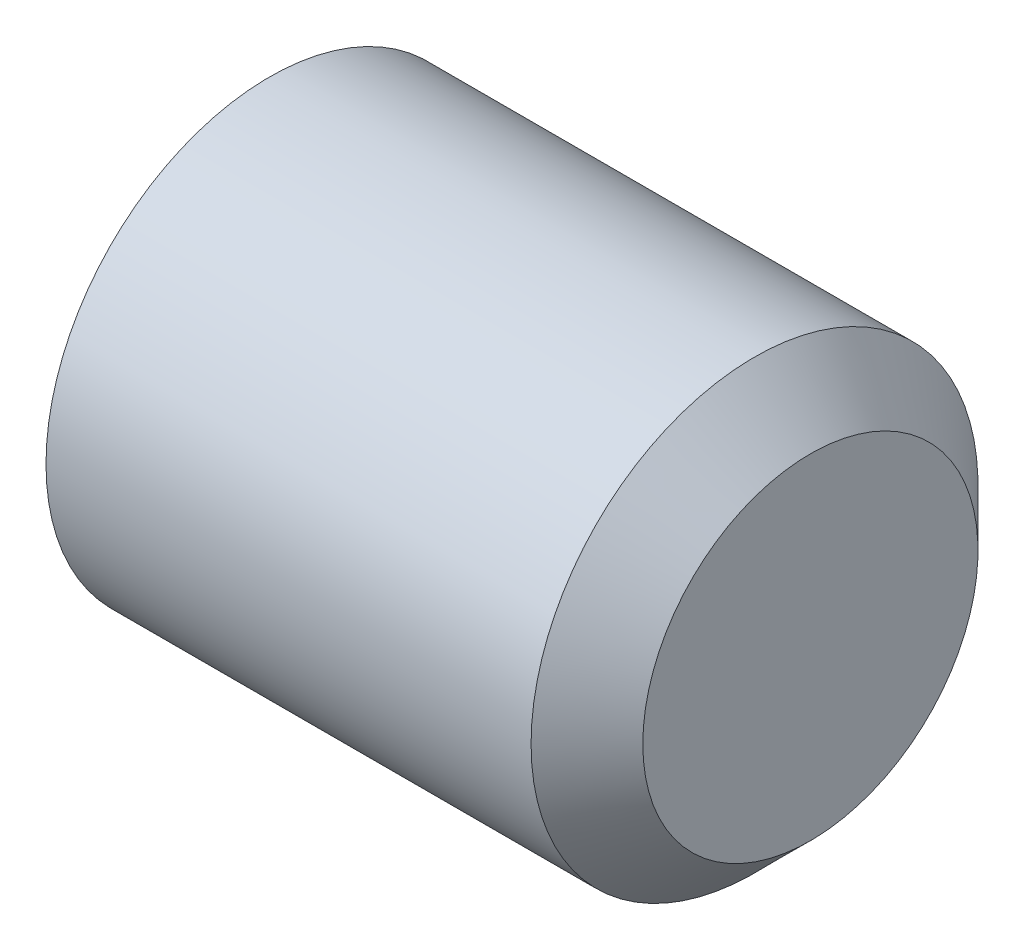
ISO-10303-21;
HEADER;
FILE_DESCRIPTION(('STEP AP214'),'2;1');
FILE_NAME('part.step','',(''),(''),'','','');
FILE_SCHEMA(('AUTOMOTIVE_DESIGN { 1 0 10303 214 1 1 1 1 }'));
ENDSEC;
DATA;
#1=APPLICATION_CONTEXT('core data for automotive mechanical design processes');
#2=APPLICATION_PROTOCOL_DEFINITION('international standard','automotive_design',2000,#1);
#3=PRODUCT_CONTEXT('',#1,'mechanical');
#4=PRODUCT('Part','Part','',(#3));
#5=PRODUCT_RELATED_PRODUCT_CATEGORY('part','',(#4));
#6=PRODUCT_DEFINITION_FORMATION('','',#4);
#7=PRODUCT_DEFINITION_CONTEXT('part definition',#1,'design');
#8=PRODUCT_DEFINITION('design','',#6,#7);
#9=PRODUCT_DEFINITION_SHAPE('','',#8);
#10=(LENGTH_UNIT() NAMED_UNIT(*) SI_UNIT(.MILLI.,.METRE.));
#11=(NAMED_UNIT(*) PLANE_ANGLE_UNIT() SI_UNIT($,.RADIAN.));
#12=(NAMED_UNIT(*) SI_UNIT($,.STERADIAN.) SOLID_ANGLE_UNIT());
#13=UNCERTAINTY_MEASURE_WITH_UNIT(LENGTH_MEASURE(1.E-05),#10,'distance_accuracy_value','');
#14=(GEOMETRIC_REPRESENTATION_CONTEXT(3) GLOBAL_UNCERTAINTY_ASSIGNED_CONTEXT((#13)) GLOBAL_UNIT_ASSIGNED_CONTEXT((#10,
#11,#12)) REPRESENTATION_CONTEXT('',''));
#15=CARTESIAN_POINT('',(0.,0.,0.));
#16=DIRECTION('',(0.,0.,1.));
#17=DIRECTION('',(1.,0.,0.));
#18=AXIS2_PLACEMENT_3D('',#15,#16,#17);
#19=CARTESIAN_POINT('',(0.,0.,0.));
#20=DIRECTION('',(-1.,0.,0.));
#21=DIRECTION('',(0.,0.,1.));
#22=AXIS2_PLACEMENT_3D('',#19,#20,#21);
#23=PLANE('',#22);
#24=CARTESIAN_POINT('',(0.,0.,0.));
#25=DIRECTION('',(-1.,0.,0.));
#26=DIRECTION('',(0.,0.,1.));
#27=AXIS2_PLACEMENT_3D('',#24,#25,#26);
#28=CIRCLE('',#27,10.352);
#29=CARTESIAN_POINT('',(0.,0.,10.352));
#30=VERTEX_POINT('',#29);
#31=EDGE_CURVE('E10',#30,#30,#28,.T.);
#32=ORIENTED_EDGE('',*,*,#31,.T.);
#33=EDGE_LOOP('',(#32));
#34=FACE_BOUND('',#33,.T.);
#35=ADVANCED_FACE('F32',(#34),#23,.T.);
#36=CARTESIAN_POINT('',(0.,0.,0.));
#37=DIRECTION('',(1.,0.,0.));
#38=DIRECTION('',(0.,0.,-1.));
#39=AXIS2_PLACEMENT_3D('',#36,#37,#38);
#40=CONICAL_SURFACE('',#39,10.352,1.04719755119662);
#41=CARTESIAN_POINT('',(0.951473243624452,0.,0.));
#42=DIRECTION('',(-1.,0.,0.));
#43=DIRECTION('',(0.,0.,1.));
#44=AXIS2_PLACEMENT_3D('',#41,#42,#43);
#45=CIRCLE('',#44,12.);
#46=CARTESIAN_POINT('',(0.951473243624452,0.,12.));
#47=VERTEX_POINT('',#46);
#48=EDGE_CURVE('E38',#47,#47,#45,.T.);
#49=ORIENTED_EDGE('',*,*,#48,.T.);
#50=EDGE_LOOP('',(#49));
#51=FACE_BOUND('',#50,.T.);
#52=ORIENTED_EDGE('',*,*,#31,.F.);
#53=EDGE_LOOP('',(#52));
#54=FACE_BOUND('',#53,.T.);
#55=ADVANCED_FACE('F64',(#51,#54),#40,.T.);
#56=CARTESIAN_POINT('',(-12.7,0.,0.));
#57=DIRECTION('',(-1.,0.,0.));
#58=DIRECTION('',(0.,0.,1.));
#59=AXIS2_PLACEMENT_3D('',#56,#57,#58);
#60=CYLINDRICAL_SURFACE('',#59,12.);
#61=CARTESIAN_POINT('',(27.,0.,0.));
#62=DIRECTION('',(-1.,0.,0.));
#63=DIRECTION('',(0.,0.,1.));
#64=AXIS2_PLACEMENT_3D('',#61,#62,#63);
#65=CIRCLE('',#64,12.);
#66=CARTESIAN_POINT('',(27.,0.,12.));
#67=VERTEX_POINT('',#66);
#68=EDGE_CURVE('E42',#67,#67,#65,.T.);
#69=ORIENTED_EDGE('',*,*,#68,.T.);
#70=EDGE_LOOP('',(#69));
#71=FACE_BOUND('',#70,.T.);
#72=ORIENTED_EDGE('',*,*,#48,.F.);
#73=EDGE_LOOP('',(#72));
#74=FACE_BOUND('',#73,.T.);
#75=ADVANCED_FACE('F61',(#71,#74),#60,.T.);
#76=CARTESIAN_POINT('',(27.,0.,0.));
#77=DIRECTION('',(-1.,0.,0.));
#78=DIRECTION('',(0.,0.,1.));
#79=AXIS2_PLACEMENT_3D('',#76,#77,#78);
#80=CONICAL_SURFACE('',#79,12.,0.785398163397449);
#81=CARTESIAN_POINT('',(30.,0.,0.));
#82=DIRECTION('',(-1.,0.,0.));
#83=DIRECTION('',(0.,0.,1.));
#84=AXIS2_PLACEMENT_3D('',#81,#82,#83);
#85=CIRCLE('',#84,9.);
#86=CARTESIAN_POINT('',(30.,0.,9.));
#87=VERTEX_POINT('',#86);
#88=EDGE_CURVE('E46',#87,#87,#85,.T.);
#89=ORIENTED_EDGE('',*,*,#88,.T.);
#90=EDGE_LOOP('',(#89));
#91=FACE_BOUND('',#90,.T.);
#92=ORIENTED_EDGE('',*,*,#68,.F.);
#93=EDGE_LOOP('',(#92));
#94=FACE_BOUND('',#93,.T.);
#95=ADVANCED_FACE('F52',(#91,#94),#80,.T.);
#96=CARTESIAN_POINT('',(30.,9.,0.));
#97=DIRECTION('',(1.,0.,0.));
#98=DIRECTION('',(0.,0.,-1.));
#99=AXIS2_PLACEMENT_3D('',#96,#97,#98);
#100=PLANE('',#99);
#101=ORIENTED_EDGE('',*,*,#88,.F.);
#102=EDGE_LOOP('',(#101));
#103=FACE_BOUND('',#102,.T.);
#104=ADVANCED_FACE('F55',(#103),#100,.T.);
#105=CLOSED_SHELL('',(#35,#55,#75,#95,#104));
#106=MANIFOLD_SOLID_BREP('B2',#105);
#107=ADVANCED_BREP_SHAPE_REPRESENTATION('',(#18,#106),#14);
#108=SHAPE_DEFINITION_REPRESENTATION(#9,#107);
ENDSEC;
END-ISO-10303-21;
